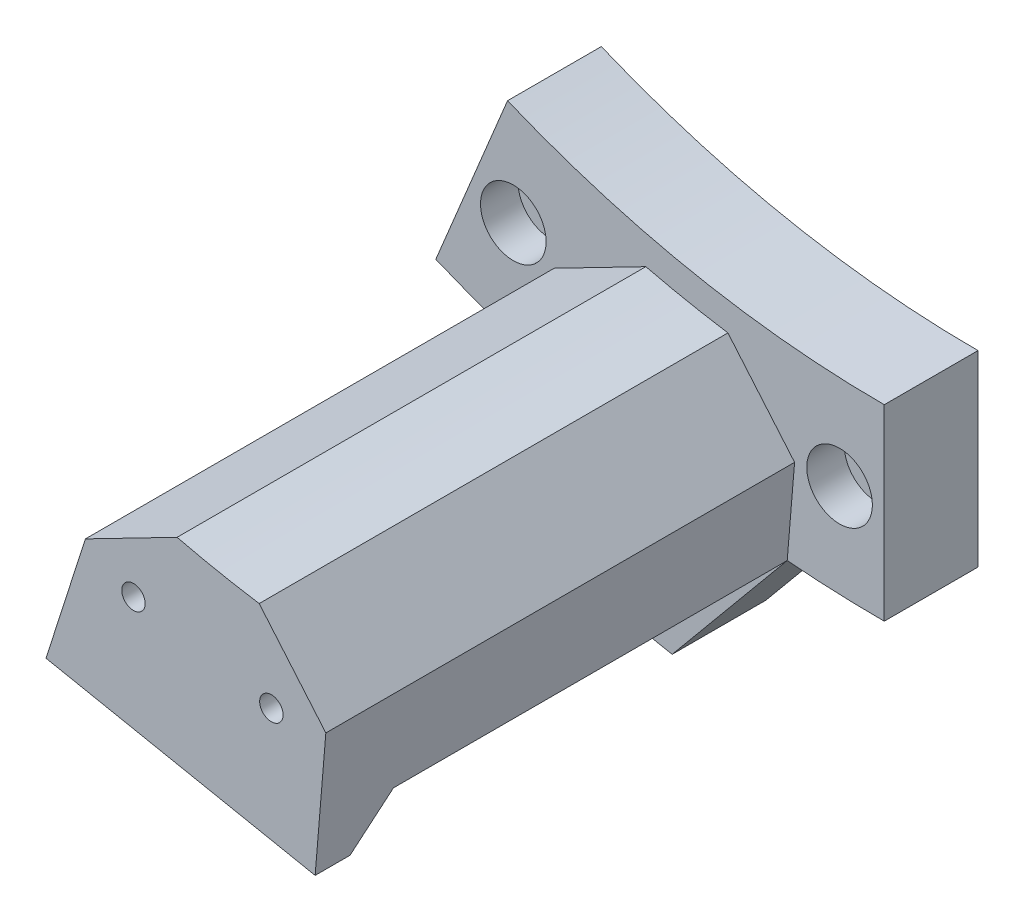
ISO-10303-21;
HEADER;
FILE_DESCRIPTION(('STEP AP214'),'2;1');
FILE_NAME('part.step','',(''),(''),'','','');
FILE_SCHEMA(('AUTOMOTIVE_DESIGN { 1 0 10303 214 1 1 1 1 }'));
ENDSEC;
DATA;
#1=APPLICATION_CONTEXT('core data for automotive mechanical design processes');
#2=APPLICATION_PROTOCOL_DEFINITION('international standard','automotive_design',2000,#1);
#3=PRODUCT_CONTEXT('',#1,'mechanical');
#4=PRODUCT('Part','Part','',(#3));
#5=PRODUCT_RELATED_PRODUCT_CATEGORY('part','',(#4));
#6=PRODUCT_DEFINITION_FORMATION('','',#4);
#7=PRODUCT_DEFINITION_CONTEXT('part definition',#1,'design');
#8=PRODUCT_DEFINITION('design','',#6,#7);
#9=PRODUCT_DEFINITION_SHAPE('','',#8);
#10=(LENGTH_UNIT() NAMED_UNIT(*) SI_UNIT(.MILLI.,.METRE.));
#11=(NAMED_UNIT(*) PLANE_ANGLE_UNIT() SI_UNIT($,.RADIAN.));
#12=(NAMED_UNIT(*) SI_UNIT($,.STERADIAN.) SOLID_ANGLE_UNIT());
#13=UNCERTAINTY_MEASURE_WITH_UNIT(LENGTH_MEASURE(1.E-05),#10,'distance_accuracy_value','');
#14=(GEOMETRIC_REPRESENTATION_CONTEXT(3) GLOBAL_UNCERTAINTY_ASSIGNED_CONTEXT((#13)) GLOBAL_UNIT_ASSIGNED_CONTEXT((#10,
#11,#12)) REPRESENTATION_CONTEXT('',''));
#15=CARTESIAN_POINT('',(0.,0.,0.));
#16=DIRECTION('',(0.,0.,1.));
#17=DIRECTION('',(1.,0.,0.));
#18=AXIS2_PLACEMENT_3D('',#15,#16,#17);
#19=CARTESIAN_POINT('',(0.,0.,10.));
#20=DIRECTION('',(0.,0.,-1.));
#21=DIRECTION('',(-1.,0.,0.));
#22=AXIS2_PLACEMENT_3D('',#19,#20,#21);
#23=CYLINDRICAL_SURFACE('',#22,125.);
#24=DIRECTION('',(0.,0.,-1.));
#25=VECTOR('',#24,1.);
#26=CARTESIAN_POINT('',(-10.3510259390256,-124.57068781222,10.));
#27=LINE('',#26,#25);
#28=CARTESIAN_POINT('',(-10.3510259390255,-124.57068781222,10.));
#29=VERTEX_POINT('',#28);
#30=CARTESIAN_POINT('',(-10.3510259390256,-124.57068781222,0.));
#31=VERTEX_POINT('',#30);
#32=EDGE_CURVE('E173',#29,#31,#27,.T.);
#33=ORIENTED_EDGE('',*,*,#32,.T.);
#34=CARTESIAN_POINT('',(0.,0.,0.));
#35=DIRECTION('',(0.,0.,1.));
#36=DIRECTION('',(-1.,0.,0.));
#37=AXIS2_PLACEMENT_3D('',#34,#35,#36);
#38=CIRCLE('',#37,125.);
#39=CARTESIAN_POINT('',(0.,-125.,0.));
#40=VERTEX_POINT('',#39);
#41=EDGE_CURVE('E253',#31,#40,#38,.T.);
#42=ORIENTED_EDGE('',*,*,#41,.T.);
#43=DIRECTION('',(0.,0.,-1.));
#44=VECTOR('',#43,1.);
#45=CARTESIAN_POINT('',(0.,-125.,10.));
#46=LINE('',#45,#44);
#47=CARTESIAN_POINT('',(0.,-125.,10.));
#48=VERTEX_POINT('',#47);
#49=EDGE_CURVE('E279',#48,#40,#46,.T.);
#50=ORIENTED_EDGE('',*,*,#49,.F.);
#51=CARTESIAN_POINT('',(0.,0.,10.));
#52=DIRECTION('',(0.,0.,1.));
#53=DIRECTION('',(-1.,0.,0.));
#54=AXIS2_PLACEMENT_3D('',#51,#52,#53);
#55=CIRCLE('',#54,125.);
#56=EDGE_CURVE('E258',#29,#48,#55,.T.);
#57=ORIENTED_EDGE('',*,*,#56,.F.);
#58=EDGE_LOOP('',(#33,#42,#50,#57));
#59=FACE_BOUND('',#58,.T.);
#60=ADVANCED_FACE('F40',(#59),#23,.T.);
#61=CARTESIAN_POINT('',(0.,0.,10.));
#62=DIRECTION('',(0.,0.,-1.));
#63=DIRECTION('',(-1.,0.,0.));
#64=AXIS2_PLACEMENT_3D('',#61,#62,#63);
#65=CIRCLE('',#64,125.);
#66=CARTESIAN_POINT('',(-38.1080373785014,-119.04947495541,10.));
#67=VERTEX_POINT('',#66);
#68=EDGE_CURVE('E169',#29,#67,#65,.T.);
#69=ORIENTED_EDGE('',*,*,#68,.F.);
#70=DIRECTION('',(0.,0.,-1.));
#71=VECTOR('',#70,1.);
#72=CARTESIAN_POINT('',(-10.3510259390255,-124.57068781222,58.));
#73=LINE('',#72,#71);
#74=CARTESIAN_POINT('',(-10.3510259390255,-124.57068781222,52.));
#75=VERTEX_POINT('',#74);
#76=EDGE_CURVE('E250',#75,#29,#73,.T.);
#77=ORIENTED_EDGE('',*,*,#76,.F.);
#78=CARTESIAN_POINT('',(0.,0.,52.));
#79=DIRECTION('',(0.,0.,1.));
#80=DIRECTION('',(1.,0.,0.));
#81=AXIS2_PLACEMENT_3D('',#78,#79,#80);
#82=CIRCLE('',#81,125.);
#83=CARTESIAN_POINT('',(-38.1080373785014,-119.04947495541,52.));
#84=VERTEX_POINT('',#83);
#85=EDGE_CURVE('E282',#75,#84,#82,.F.);
#86=ORIENTED_EDGE('',*,*,#85,.T.);
#87=DIRECTION('',(0.,0.,-1.));
#88=VECTOR('',#87,1.);
#89=CARTESIAN_POINT('',(-38.1080373785014,-119.04947495541,58.));
#90=LINE('',#89,#88);
#91=EDGE_CURVE('E247',#84,#67,#90,.T.);
#92=ORIENTED_EDGE('',*,*,#91,.T.);
#93=EDGE_LOOP('',(#69,#77,#86,#92));
#94=FACE_BOUND('',#93,.T.);
#95=ADVANCED_FACE('F329',(#94),#23,.T.);
#96=CARTESIAN_POINT('',(-39.5679831879644,-107.978584480613,-0.000999999999999265));
#97=DIRECTION('',(0.,0.,1.));
#98=DIRECTION('',(1.,0.,0.));
#99=AXIS2_PLACEMENT_3D('',#96,#97,#98);
#100=CYLINDRICAL_SURFACE('',#99,1.75);
#101=CARTESIAN_POINT('',(-39.5679831879644,-107.978584480613,0.));
#102=DIRECTION('',(0.,0.,-1.));
#103=DIRECTION('',(-1.,0.,0.));
#104=AXIS2_PLACEMENT_3D('',#101,#102,#103);
#105=CIRCLE('',#104,1.75);
#106=CARTESIAN_POINT('',(-41.3179831879644,-107.978584480613,0.));
#107=VERTEX_POINT('',#106);
#108=EDGE_CURVE('E221',#107,#107,#105,.F.);
#109=ORIENTED_EDGE('',*,*,#108,.F.);
#110=EDGE_LOOP('',(#109));
#111=FACE_BOUND('',#110,.T.);
#112=CARTESIAN_POINT('',(-39.5679831879644,-107.978584480613,6.));
#113=DIRECTION('',(0.,0.,1.));
#114=DIRECTION('',(1.,0.,0.));
#115=AXIS2_PLACEMENT_3D('',#112,#113,#114);
#116=CIRCLE('',#115,1.75);
#117=CARTESIAN_POINT('',(-37.8179831879644,-107.978584480613,6.));
#118=VERTEX_POINT('',#117);
#119=EDGE_CURVE('E224',#118,#118,#116,.F.);
#120=ORIENTED_EDGE('',*,*,#119,.F.);
#121=EDGE_LOOP('',(#120));
#122=FACE_BOUND('',#121,.T.);
#123=ADVANCED_FACE('F335',(#111,#122),#100,.F.);
#124=CARTESIAN_POINT('',(-4.76556552085401,-114.901215769314,-0.000999999999999265));
#125=DIRECTION('',(0.,0.,1.));
#126=DIRECTION('',(1.,0.,0.));
#127=AXIS2_PLACEMENT_3D('',#124,#125,#126);
#128=CYLINDRICAL_SURFACE('',#127,1.75000000000001);
#129=CARTESIAN_POINT('',(-4.76556552085401,-114.901215769314,0.));
#130=DIRECTION('',(0.,0.,-1.));
#131=DIRECTION('',(-1.,0.,0.));
#132=AXIS2_PLACEMENT_3D('',#129,#130,#131);
#133=CIRCLE('',#132,1.75000000000001);
#134=CARTESIAN_POINT('',(-6.51556552085402,-114.901215769314,0.));
#135=VERTEX_POINT('',#134);
#136=EDGE_CURVE('E217',#135,#135,#133,.F.);
#137=ORIENTED_EDGE('',*,*,#136,.F.);
#138=EDGE_LOOP('',(#137));
#139=FACE_BOUND('',#138,.T.);
#140=CARTESIAN_POINT('',(-4.76556552085401,-114.901215769314,6.));
#141=DIRECTION('',(0.,0.,1.));
#142=DIRECTION('',(1.,0.,0.));
#143=AXIS2_PLACEMENT_3D('',#140,#141,#142);
#144=CIRCLE('',#143,1.75000000000001);
#145=CARTESIAN_POINT('',(-3.01556552085401,-114.901215769314,6.));
#146=VERTEX_POINT('',#145);
#147=EDGE_CURVE('E208',#146,#146,#144,.F.);
#148=ORIENTED_EDGE('',*,*,#147,.F.);
#149=EDGE_LOOP('',(#148));
#150=FACE_BOUND('',#149,.T.);
#151=ADVANCED_FACE('F347',(#139,#150),#128,.F.);
#152=CARTESIAN_POINT('',(0.,0.,10.));
#153=DIRECTION('',(0.,0.,-1.));
#154=DIRECTION('',(-1.,0.,0.));
#155=AXIS2_PLACEMENT_3D('',#152,#153,#154);
#156=PLANE('',#155);
#157=CARTESIAN_POINT('',(-39.5679831879644,-107.978584480613,10.));
#158=DIRECTION('',(0.,0.,1.));
#159=DIRECTION('',(1.,0.,0.));
#160=AXIS2_PLACEMENT_3D('',#157,#158,#159);
#161=CIRCLE('',#160,3.5);
#162=CARTESIAN_POINT('',(-36.0679831879644,-107.978584480613,10.));
#163=VERTEX_POINT('',#162);
#164=EDGE_CURVE('E209',#163,#163,#161,.T.);
#165=ORIENTED_EDGE('',*,*,#164,.F.);
#166=EDGE_LOOP('',(#165));
#167=FACE_BOUND('',#166,.T.);
#168=CARTESIAN_POINT('',(-4.76556552085401,-114.901215769314,10.));
#169=DIRECTION('',(0.,0.,1.));
#170=DIRECTION('',(1.,0.,0.));
#171=AXIS2_PLACEMENT_3D('',#168,#169,#170);
#172=CIRCLE('',#171,3.5);
#173=CARTESIAN_POINT('',(-1.26556552085401,-114.901215769314,10.));
#174=VERTEX_POINT('',#173);
#175=EDGE_CURVE('E196',#174,#174,#172,.T.);
#176=ORIENTED_EDGE('',*,*,#175,.F.);
#177=EDGE_LOOP('',(#176));
#178=FACE_BOUND('',#177,.T.);
#179=DIRECTION('',(-0.304864299028011,-0.952395799643278,0.));
#180=VECTOR('',#179,1.);
#181=CARTESIAN_POINT('',(-32.9253442950252,-102.858746361474,10.));
#182=LINE('',#181,#180);
#183=CARTESIAN_POINT('',(-35.2118265377353,-110.001714858799,10.));
#184=VERTEX_POINT('',#183);
#185=EDGE_CURVE('E244',#184,#67,#182,.T.);
#186=ORIENTED_EDGE('',*,*,#185,.F.);
#187=DIRECTION('',(-0.889017141485737,-0.457873915116956,0.));
#188=VECTOR('',#187,1.);
#189=CARTESIAN_POINT('',(37.3949441605316,-72.6067706982671,10.));
#190=LINE('',#189,#188);
#191=CARTESIAN_POINT('',(-25.4295453835583,-104.963508999964,10.));
#192=VERTEX_POINT('',#191);
#193=EDGE_CURVE('E11',#184,#192,#190,.F.);
#194=ORIENTED_EDGE('',*,*,#193,.T.);
#195=CARTESIAN_POINT('',(0.,0.,10.));
#196=DIRECTION('',(0.,0.,-1.));
#197=DIRECTION('',(-1.,0.,0.));
#198=AXIS2_PLACEMENT_3D('',#195,#196,#197);
#199=CIRCLE('',#198,108.);
#200=CARTESIAN_POINT('',(-16.6739593962537,-106.705103336495,10.));
#201=VERTEX_POINT('',#200);
#202=EDGE_CURVE('E241',#201,#192,#199,.T.);
#203=ORIENTED_EDGE('',*,*,#202,.F.);
#204=DIRECTION('',(-0.646123979642962,0.76323246978253,0.));
#205=VECTOR('',#204,1.);
#206=CARTESIAN_POINT('',(-62.3338317530755,-52.7694837854156,10.));
#207=LINE('',#206,#205);
#208=CARTESIAN_POINT('',(-9.56434796765956,-115.103315538491,10.));
#209=VERTEX_POINT('',#208);
#210=EDGE_CURVE('E49',#201,#209,#207,.F.);
#211=ORIENTED_EDGE('',*,*,#210,.T.);
#212=DIRECTION('',(0.0828082075122041,0.996565502497762,0.));
#213=VECTOR('',#212,1.);
#214=CARTESIAN_POINT('',(-8.94328641131803,-107.629074269758,10.));
#215=LINE('',#214,#213);
#216=EDGE_CURVE('E238',#29,#209,#215,.T.);
#217=ORIENTED_EDGE('',*,*,#216,.F.);
#218=ORIENTED_EDGE('',*,*,#56,.T.);
#219=DIRECTION('',(0.,1.,0.));
#220=VECTOR('',#219,1.);
#221=CARTESIAN_POINT('',(0.,-105.,10.));
#222=LINE('',#221,#220);
#223=CARTESIAN_POINT('',(0.,-105.,10.));
#224=VERTEX_POINT('',#223);
#225=EDGE_CURVE('E257',#48,#224,#222,.T.);
#226=ORIENTED_EDGE('',*,*,#225,.T.);
#227=CARTESIAN_POINT('',(0.,0.,10.));
#228=DIRECTION('',(0.,0.,-1.));
#229=DIRECTION('',(-1.,0.,0.));
#230=AXIS2_PLACEMENT_3D('',#227,#228,#229);
#231=CIRCLE('',#230,105.);
#232=CARTESIAN_POINT('',(-40.1817603983344,-97.0073509136851,10.));
#233=VERTEX_POINT('',#232);
#234=EDGE_CURVE('E260',#224,#233,#231,.T.);
#235=ORIENTED_EDGE('',*,*,#234,.T.);
#236=DIRECTION('',(-0.38268343236509,-0.923879532511286,0.));
#237=VECTOR('',#236,1.);
#238=CARTESIAN_POINT('',(-40.1817603983345,-97.0073509136851,10.));
#239=LINE('',#238,#237);
#240=CARTESIAN_POINT('',(-47.8354290456363,-115.484941563911,10.));
#241=VERTEX_POINT('',#240);
#242=EDGE_CURVE('E262',#233,#241,#239,.T.);
#243=ORIENTED_EDGE('',*,*,#242,.T.);
#244=EDGE_CURVE('E254',#241,#67,#55,.T.);
#245=ORIENTED_EDGE('',*,*,#244,.T.);
#246=EDGE_LOOP('',(#186,#194,#203,#211,#217,#218,#226,#235,#243,#245));
#247=FACE_BOUND('',#246,.T.);
#248=ADVANCED_FACE('F339',(#167,#178,#247),#156,.F.);
#249=CARTESIAN_POINT('',(-47.8354290456363,-115.484941563911,0.));
#250=VERTEX_POINT('',#249);
#251=CARTESIAN_POINT('',(-38.1080373785015,-119.04947495541,0.));
#252=VERTEX_POINT('',#251);
#253=EDGE_CURVE('E56',#250,#252,#38,.T.);
#254=ORIENTED_EDGE('',*,*,#253,.T.);
#255=DIRECTION('',(0.,0.,-1.));
#256=VECTOR('',#255,1.);
#257=CARTESIAN_POINT('',(-38.1080373785014,-119.04947495541,10.));
#258=LINE('',#257,#256);
#259=EDGE_CURVE('E190',#67,#252,#258,.T.);
#260=ORIENTED_EDGE('',*,*,#259,.F.);
#261=ORIENTED_EDGE('',*,*,#244,.F.);
#262=DIRECTION('',(0.,0.,-1.));
#263=VECTOR('',#262,1.);
#264=CARTESIAN_POINT('',(-47.8354290456363,-115.484941563911,10.));
#265=LINE('',#264,#263);
#266=EDGE_CURVE('E264',#241,#250,#265,.T.);
#267=ORIENTED_EDGE('',*,*,#266,.T.);
#268=EDGE_LOOP('',(#254,#260,#261,#267));
#269=FACE_BOUND('',#268,.T.);
#270=ADVANCED_FACE('F311',(#269),#23,.T.);
#271=CARTESIAN_POINT('',(0.,-105.,10.));
#272=DIRECTION('',(-1.,0.,0.));
#273=DIRECTION('',(0.,-1.,0.));
#274=AXIS2_PLACEMENT_3D('',#271,#272,#273);
#275=PLANE('',#274);
#276=DIRECTION('',(0.,1.,0.));
#277=VECTOR('',#276,1.);
#278=CARTESIAN_POINT('',(0.,-105.,0.));
#279=LINE('',#278,#277);
#280=CARTESIAN_POINT('',(0.,-105.,0.));
#281=VERTEX_POINT('',#280);
#282=EDGE_CURVE('E266',#40,#281,#279,.T.);
#283=ORIENTED_EDGE('',*,*,#282,.T.);
#284=DIRECTION('',(0.,0.,-1.));
#285=VECTOR('',#284,1.);
#286=CARTESIAN_POINT('',(0.,-105.,10.));
#287=LINE('',#286,#285);
#288=EDGE_CURVE('E276',#224,#281,#287,.T.);
#289=ORIENTED_EDGE('',*,*,#288,.F.);
#290=ORIENTED_EDGE('',*,*,#225,.F.);
#291=ORIENTED_EDGE('',*,*,#49,.T.);
#292=EDGE_LOOP('',(#283,#289,#290,#291));
#293=FACE_BOUND('',#292,.T.);
#294=ADVANCED_FACE('F338',(#293),#275,.F.);
#295=CARTESIAN_POINT('',(0.,0.,10.));
#296=DIRECTION('',(0.,0.,-1.));
#297=DIRECTION('',(-1.,0.,0.));
#298=AXIS2_PLACEMENT_3D('',#295,#296,#297);
#299=CYLINDRICAL_SURFACE('',#298,105.);
#300=CARTESIAN_POINT('',(0.,0.,0.));
#301=DIRECTION('',(0.,0.,-1.));
#302=DIRECTION('',(-1.,0.,0.));
#303=AXIS2_PLACEMENT_3D('',#300,#301,#302);
#304=CIRCLE('',#303,105.);
#305=CARTESIAN_POINT('',(-40.1817603983344,-97.0073509136851,0.));
#306=VERTEX_POINT('',#305);
#307=EDGE_CURVE('E268',#281,#306,#304,.T.);
#308=ORIENTED_EDGE('',*,*,#307,.T.);
#309=DIRECTION('',(0.,0.,-1.));
#310=VECTOR('',#309,1.);
#311=CARTESIAN_POINT('',(-40.1817603983344,-97.0073509136851,10.));
#312=LINE('',#311,#310);
#313=EDGE_CURVE('E273',#233,#306,#312,.T.);
#314=ORIENTED_EDGE('',*,*,#313,.F.);
#315=ORIENTED_EDGE('',*,*,#234,.F.);
#316=ORIENTED_EDGE('',*,*,#288,.T.);
#317=EDGE_LOOP('',(#308,#314,#315,#316));
#318=FACE_BOUND('',#317,.T.);
#319=ADVANCED_FACE('F345',(#318),#299,.F.);
#320=CARTESIAN_POINT('',(-40.1817603983345,-97.0073509136851,10.));
#321=DIRECTION('',(0.923879532511287,-0.38268343236509,0.));
#322=DIRECTION('',(0.38268343236509,0.923879532511287,0.));
#323=AXIS2_PLACEMENT_3D('',#320,#321,#322);
#324=PLANE('',#323);
#325=DIRECTION('',(-0.38268343236509,-0.923879532511286,0.));
#326=VECTOR('',#325,1.);
#327=CARTESIAN_POINT('',(-40.1817603983345,-97.0073509136851,0.));
#328=LINE('',#327,#326);
#329=EDGE_CURVE('E270',#306,#250,#328,.T.);
#330=ORIENTED_EDGE('',*,*,#329,.T.);
#331=ORIENTED_EDGE('',*,*,#266,.F.);
#332=ORIENTED_EDGE('',*,*,#242,.F.);
#333=ORIENTED_EDGE('',*,*,#313,.T.);
#334=EDGE_LOOP('',(#330,#331,#332,#333));
#335=FACE_BOUND('',#334,.T.);
#336=ADVANCED_FACE('F364',(#335),#324,.F.);
#337=CARTESIAN_POINT('',(0.,0.,0.));
#338=DIRECTION('',(0.,0.,-1.));
#339=DIRECTION('',(-1.,0.,0.));
#340=AXIS2_PLACEMENT_3D('',#337,#338,#339);
#341=PLANE('',#340);
#342=ORIENTED_EDGE('',*,*,#136,.T.);
#343=EDGE_LOOP('',(#342));
#344=FACE_BOUND('',#343,.T.);
#345=ORIENTED_EDGE('',*,*,#108,.T.);
#346=EDGE_LOOP('',(#345));
#347=FACE_BOUND('',#346,.T.);
#348=ORIENTED_EDGE('',*,*,#253,.F.);
#349=ORIENTED_EDGE('',*,*,#329,.F.);
#350=ORIENTED_EDGE('',*,*,#307,.F.);
#351=ORIENTED_EDGE('',*,*,#282,.F.);
#352=ORIENTED_EDGE('',*,*,#41,.F.);
#353=DIRECTION('',(0.638255147729026,0.769824893334451,0.));
#354=VECTOR('',#353,1.);
#355=CARTESIAN_POINT('',(55.0728150641998,-45.6603937064205,0.));
#356=LINE('',#355,#354);
#357=CARTESIAN_POINT('',(-22.625550905417,-139.375480075322,0.));
#358=VERTEX_POINT('',#357);
#359=EDGE_CURVE('E184',#358,#31,#356,.T.);
#360=ORIENTED_EDGE('',*,*,#359,.F.);
#361=DIRECTION('',(0.98078528040323,-0.195090322016128,0.));
#362=VECTOR('',#361,1.);
#363=CARTESIAN_POINT('',(-27.5294773074331,-138.400028465241,0.));
#364=LINE('',#363,#362);
#365=CARTESIAN_POINT('',(-32.4334037094493,-137.42457685516,0.));
#366=VERTEX_POINT('',#365);
#367=EDGE_CURVE('E164',#366,#358,#364,.T.);
#368=ORIENTED_EDGE('',*,*,#367,.F.);
#369=DIRECTION('',(-0.295071635005498,0.955475133227015,0.));
#370=VECTOR('',#369,1.);
#371=CARTESIAN_POINT('',(-68.3541228223079,-21.1092492929933,0.));
#372=LINE('',#371,#370);
#373=EDGE_CURVE('E174',#366,#252,#372,.T.);
#374=ORIENTED_EDGE('',*,*,#373,.T.);
#375=EDGE_LOOP('',(#348,#349,#350,#351,#352,#360,#368,#374));
#376=FACE_BOUND('',#375,.T.);
#377=ADVANCED_FACE('F361',(#344,#347,#376),#341,.T.);
#378=CARTESIAN_POINT('',(-8.94328641131803,-107.629074269758,58.));
#379=DIRECTION('',(-0.996565502497761,0.0828082075122041,0.));
#380=DIRECTION('',(-0.0828082075122041,-0.996565502497761,0.));
#381=AXIS2_PLACEMENT_3D('',#378,#379,#380);
#382=PLANE('',#381);
#383=ORIENTED_EDGE('',*,*,#216,.T.);
#384=DIRECTION('',(0.,0.,1.));
#385=VECTOR('',#384,1.);
#386=CARTESIAN_POINT('',(-9.56434796765956,-115.103315538491,58.));
#387=LINE('',#386,#385);
#388=CARTESIAN_POINT('',(-9.56434796765954,-115.103315538491,60.));
#389=VERTEX_POINT('',#388);
#390=EDGE_CURVE('E404',#209,#389,#387,.T.);
#391=ORIENTED_EDGE('',*,*,#390,.T.);
#392=DIRECTION('',(0.0828082075122008,0.996565502497762,0.));
#393=VECTOR('',#392,1.);
#394=CARTESIAN_POINT('',(-10.705530952967,-128.837021765948,60.));
#395=LINE('',#394,#393);
#396=CARTESIAN_POINT('',(-10.705530952967,-128.837021765948,60.));
#397=VERTEX_POINT('',#396);
#398=EDGE_CURVE('E231',#397,#389,#395,.T.);
#399=ORIENTED_EDGE('',*,*,#398,.F.);
#400=DIRECTION('',(0.,0.,-1.));
#401=VECTOR('',#400,1.);
#402=CARTESIAN_POINT('',(-10.705530952967,-128.837021765948,60.));
#403=LINE('',#402,#401);
#404=CARTESIAN_POINT('',(-10.705530952967,-128.837021765948,56.2810371651781));
#405=VERTEX_POINT('',#404);
#406=EDGE_CURVE('E234',#397,#405,#403,.T.);
#407=ORIENTED_EDGE('',*,*,#406,.T.);
#408=DIRECTION('',(-0.0585542450697827,-0.704678224712751,0.707106781186543));
#409=VECTOR('',#408,1.);
#410=CARTESIAN_POINT('',(0.,0.,-72.9999999999985));
#411=LINE('',#410,#409);
#412=EDGE_CURVE('E294',#405,#75,#411,.F.);
#413=ORIENTED_EDGE('',*,*,#412,.T.);
#414=ORIENTED_EDGE('',*,*,#76,.T.);
#415=EDGE_LOOP('',(#383,#391,#399,#407,#413,#414));
#416=FACE_BOUND('',#415,.T.);
#417=ADVANCED_FACE('F359',(#416),#382,.F.);
#418=CARTESIAN_POINT('',(0.,0.,58.));
#419=DIRECTION('',(0.,0.,-1.));
#420=DIRECTION('',(-1.,0.,0.));
#421=AXIS2_PLACEMENT_3D('',#418,#419,#420);
#422=CYLINDRICAL_SURFACE('',#421,108.);
#423=CARTESIAN_POINT('',(0.,0.,60.));
#424=DIRECTION('',(0.,0.,-1.));
#425=DIRECTION('',(1.,0.,0.));
#426=AXIS2_PLACEMENT_3D('',#423,#424,#425);
#427=CIRCLE('',#426,108.);
#428=CARTESIAN_POINT('',(-16.6739593962537,-106.705103336495,60.));
#429=VERTEX_POINT('',#428);
#430=CARTESIAN_POINT('',(-25.4295453835583,-104.963508999964,60.));
#431=VERTEX_POINT('',#430);
#432=EDGE_CURVE('E220',#429,#431,#427,.T.);
#433=ORIENTED_EDGE('',*,*,#432,.F.);
#434=DIRECTION('',(0.,0.,-1.));
#435=VECTOR('',#434,1.);
#436=CARTESIAN_POINT('',(-16.6739593962537,-106.705103336495,58.));
#437=LINE('',#436,#435);
#438=EDGE_CURVE('E409',#429,#201,#437,.T.);
#439=ORIENTED_EDGE('',*,*,#438,.T.);
#440=ORIENTED_EDGE('',*,*,#202,.T.);
#441=DIRECTION('',(0.,0.,-1.));
#442=VECTOR('',#441,1.);
#443=CARTESIAN_POINT('',(-25.4295453835583,-104.963508999964,58.));
#444=LINE('',#443,#442);
#445=EDGE_CURVE('E412',#192,#431,#444,.F.);
#446=ORIENTED_EDGE('',*,*,#445,.T.);
#447=EDGE_LOOP('',(#433,#439,#440,#446));
#448=FACE_BOUND('',#447,.T.);
#449=ADVANCED_FACE('F421',(#448),#422,.F.);
#450=CARTESIAN_POINT('',(-32.9253442950252,-102.858746361474,58.));
#451=DIRECTION('',(0.952395799643278,-0.304864299028011,0.));
#452=DIRECTION('',(0.304864299028011,0.952395799643278,0.));
#453=AXIS2_PLACEMENT_3D('',#450,#451,#452);
#454=PLANE('',#453);
#455=DIRECTION('',(-0.304864299028014,-0.952395799643277,0.));
#456=VECTOR('',#455,1.);
#457=CARTESIAN_POINT('',(-32.9253442950252,-102.858746361474,60.));
#458=LINE('',#457,#456);
#459=CARTESIAN_POINT('',(-35.2118265377353,-110.001714858799,60.));
#460=VERTEX_POINT('',#459);
#461=CARTESIAN_POINT('',(-39.4131727729763,-123.126716769642,60.));
#462=VERTEX_POINT('',#461);
#463=EDGE_CURVE('E227',#460,#462,#458,.T.);
#464=ORIENTED_EDGE('',*,*,#463,.F.);
#465=DIRECTION('',(0.,0.,-1.));
#466=VECTOR('',#465,1.);
#467=CARTESIAN_POINT('',(-35.2118265377353,-110.001714858799,58.));
#468=LINE('',#467,#466);
#469=EDGE_CURVE('E392',#460,#184,#468,.T.);
#470=ORIENTED_EDGE('',*,*,#469,.T.);
#471=ORIENTED_EDGE('',*,*,#185,.T.);
#472=ORIENTED_EDGE('',*,*,#91,.F.);
#473=DIRECTION('',(0.215571613184391,0.673445528301351,-0.707106781186543));
#474=VECTOR('',#473,1.);
#475=CARTESIAN_POINT('',(0.,0.,-72.9999999999985));
#476=LINE('',#475,#474);
#477=CARTESIAN_POINT('',(-39.4131727729763,-123.126716769642,56.2810371651781));
#478=VERTEX_POINT('',#477);
#479=EDGE_CURVE('E422',#84,#478,#476,.F.);
#480=ORIENTED_EDGE('',*,*,#479,.T.);
#481=DIRECTION('',(0.,0.,-1.));
#482=VECTOR('',#481,1.);
#483=CARTESIAN_POINT('',(-39.4131727729763,-123.126716769642,60.));
#484=LINE('',#483,#482);
#485=EDGE_CURVE('E236',#462,#478,#484,.T.);
#486=ORIENTED_EDGE('',*,*,#485,.F.);
#487=EDGE_LOOP('',(#464,#470,#471,#472,#480,#486));
#488=FACE_BOUND('',#487,.T.);
#489=ADVANCED_FACE('F390',(#488),#454,.F.);
#490=CARTESIAN_POINT('',(-39.4131727729763,-123.126716769642,60.));
#491=DIRECTION('',(0.195090322016128,0.980785280403231,0.));
#492=DIRECTION('',(-0.980785280403231,0.195090322016128,0.));
#493=AXIS2_PLACEMENT_3D('',#490,#491,#492);
#494=PLANE('',#493);
#495=ORIENTED_EDGE('',*,*,#485,.T.);
#496=CARTESIAN_POINT('',(-39.4131727729763,-123.126716769642,56.2810371651781));
#497=CARTESIAN_POINT('',(-38.2201790916378,-123.364017967066,56.1433083503061));
#498=CARTESIAN_POINT('',(-37.025306607688,-123.601692881566,56.0223725359379));
#499=CARTESIAN_POINT('',(-34.6326903117571,-124.07761385322,55.8146060129514));
#500=CARTESIAN_POINT('',(-33.4349464418977,-124.315859921889,55.7277759977163));
#501=CARTESIAN_POINT('',(-31.0413679692097,-124.7919722824,55.5889688400575));
#502=CARTESIAN_POINT('',(-29.8455395690514,-125.029837340455,55.5368807754856));
#503=CARTESIAN_POINT('',(-27.4529247269721,-125.505758022921,55.4673965328125));
#504=CARTESIAN_POINT('',(-26.2561382949719,-125.743813645358,55.4499999999999));
#505=CARTESIAN_POINT('',(-23.8625654309714,-126.219924890232,55.4499999999999));
#506=CARTESIAN_POINT('',(-22.6657789989712,-126.457980512669,55.4673965328125));
#507=CARTESIAN_POINT('',(-20.2731641568919,-126.933901195135,55.5368807754856));
#508=CARTESIAN_POINT('',(-19.0773357567337,-127.17176625319,55.5889688400575));
#509=CARTESIAN_POINT('',(-16.6837572840457,-127.647878613701,55.7277759977163));
#510=CARTESIAN_POINT('',(-15.4860134141863,-127.88612468237,55.8146060129515));
#511=CARTESIAN_POINT('',(-13.0933971182553,-128.362045654024,56.0223725359379));
#512=CARTESIAN_POINT('',(-11.8985246343055,-128.599720568524,56.1433083503061));
#513=CARTESIAN_POINT('',(-10.705530952967,-128.837021765948,56.2810371651781));
#514=B_SPLINE_CURVE_WITH_KNOTS('',3,(#496,#497,#498,#499,#500,#501,#502,#503,#504,#505,#506,
#507,#508,#509,#510,#511,#512,#513),.UNSPECIFIED.,.F.,.F.,(4,2,2,2,2,2,2,2,4),(0.,
3.67231993327199,7.3447145222481,11.0053272424226,14.6659025336614,18.3264778249003,
21.9870905450748,25.6594851340509,29.3318050673228),.UNSPECIFIED.);
#515=EDGE_CURVE('E285',#478,#405,#514,.T.);
#516=ORIENTED_EDGE('',*,*,#515,.T.);
#517=ORIENTED_EDGE('',*,*,#406,.F.);
#518=DIRECTION('',(0.98078528040323,-0.195090322016128,0.));
#519=VECTOR('',#518,1.);
#520=CARTESIAN_POINT('',(-39.4131727729763,-123.126716769642,60.));
#521=LINE('',#520,#519);
#522=EDGE_CURVE('E229',#462,#397,#521,.T.);
#523=ORIENTED_EDGE('',*,*,#522,.F.);
#524=EDGE_LOOP('',(#495,#516,#517,#523));
#525=FACE_BOUND('',#524,.T.);
#526=ADVANCED_FACE('F296',(#525),#494,.F.);
#527=CARTESIAN_POINT('',(0.,0.,60.));
#528=DIRECTION('',(0.,0.,1.));
#529=DIRECTION('',(1.,0.,0.));
#530=AXIS2_PLACEMENT_3D('',#527,#528,#529);
#531=PLANE('',#530);
#532=CARTESIAN_POINT('',(-30.0839121179032,-112.798307751855,60.));
#533=DIRECTION('',(0.,0.,1.));
#534=DIRECTION('',(1.,0.,0.));
#535=AXIS2_PLACEMENT_3D('',#532,#533,#534);
#536=CIRCLE('',#535,1.25);
#537=CARTESIAN_POINT('',(-28.8339121179032,-112.798307751855,60.));
#538=VERTEX_POINT('',#537);
#539=EDGE_CURVE('E197',#538,#538,#536,.T.);
#540=ORIENTED_EDGE('',*,*,#539,.F.);
#541=EDGE_LOOP('',(#540));
#542=FACE_BOUND('',#541,.T.);
#543=CARTESIAN_POINT('',(-15.3721329118547,-115.724662582097,60.));
#544=DIRECTION('',(0.,0.,1.));
#545=DIRECTION('',(1.,0.,0.));
#546=AXIS2_PLACEMENT_3D('',#543,#544,#545);
#547=CIRCLE('',#546,1.25);
#548=CARTESIAN_POINT('',(-14.1221329118547,-115.724662582097,60.));
#549=VERTEX_POINT('',#548);
#550=EDGE_CURVE('E189',#549,#549,#547,.T.);
#551=ORIENTED_EDGE('',*,*,#550,.F.);
#552=EDGE_LOOP('',(#551));
#553=FACE_BOUND('',#552,.T.);
#554=ORIENTED_EDGE('',*,*,#398,.T.);
#555=DIRECTION('',(0.646123979642962,-0.76323246978253,0.));
#556=VECTOR('',#555,1.);
#557=CARTESIAN_POINT('',(-62.3338317530755,-52.7694837854156,60.));
#558=LINE('',#557,#556);
#559=EDGE_CURVE('E407',#389,#429,#558,.F.);
#560=ORIENTED_EDGE('',*,*,#559,.T.);
#561=ORIENTED_EDGE('',*,*,#432,.T.);
#562=DIRECTION('',(0.889017141485737,0.457873915116956,0.));
#563=VECTOR('',#562,1.);
#564=CARTESIAN_POINT('',(37.3949441605316,-72.6067706982671,60.));
#565=LINE('',#564,#563);
#566=EDGE_CURVE('E408',#431,#460,#565,.F.);
#567=ORIENTED_EDGE('',*,*,#566,.T.);
#568=ORIENTED_EDGE('',*,*,#463,.T.);
#569=ORIENTED_EDGE('',*,*,#522,.T.);
#570=EDGE_LOOP('',(#554,#560,#561,#567,#568,#569));
#571=FACE_BOUND('',#570,.T.);
#572=ADVANCED_FACE('F309',(#542,#553,#571),#531,.T.);
#573=CARTESIAN_POINT('',(0.,0.,58.));
#574=DIRECTION('',(0.,0.,1.));
#575=DIRECTION('',(1.,0.,0.));
#576=AXIS2_PLACEMENT_3D('',#573,#574,#575);
#577=CONICAL_SURFACE('',#576,131.,0.785398163397455);
#578=ORIENTED_EDGE('',*,*,#479,.F.);
#579=ORIENTED_EDGE('',*,*,#85,.F.);
#580=ORIENTED_EDGE('',*,*,#412,.F.);
#581=ORIENTED_EDGE('',*,*,#515,.F.);
#582=EDGE_LOOP('',(#578,#579,#580,#581));
#583=FACE_BOUND('',#582,.T.);
#584=ADVANCED_FACE('F301',(#583),#577,.T.);
#585=CARTESIAN_POINT('',(-4.76556552085401,-114.901215769314,6.));
#586=DIRECTION('',(0.,0.,1.));
#587=DIRECTION('',(1.,0.,0.));
#588=AXIS2_PLACEMENT_3D('',#585,#586,#587);
#589=PLANE('',#588);
#590=CARTESIAN_POINT('',(-4.76556552085401,-114.901215769314,6.));
#591=DIRECTION('',(0.,0.,1.));
#592=DIRECTION('',(1.,0.,0.));
#593=AXIS2_PLACEMENT_3D('',#590,#591,#592);
#594=CIRCLE('',#593,3.5);
#595=CARTESIAN_POINT('',(-1.26556552085401,-114.901215769314,6.));
#596=VERTEX_POINT('',#595);
#597=EDGE_CURVE('E212',#596,#596,#594,.T.);
#598=ORIENTED_EDGE('',*,*,#597,.T.);
#599=EDGE_LOOP('',(#598));
#600=FACE_BOUND('',#599,.T.);
#601=ORIENTED_EDGE('',*,*,#147,.T.);
#602=EDGE_LOOP('',(#601));
#603=FACE_BOUND('',#602,.T.);
#604=ADVANCED_FACE('F308',(#600,#603),#589,.T.);
#605=CARTESIAN_POINT('',(-4.76556552085401,-114.901215769314,6.));
#606=DIRECTION('',(0.,0.,1.));
#607=DIRECTION('',(1.,0.,0.));
#608=AXIS2_PLACEMENT_3D('',#605,#606,#607);
#609=CYLINDRICAL_SURFACE('',#608,3.5);
#610=ORIENTED_EDGE('',*,*,#597,.F.);
#611=EDGE_LOOP('',(#610));
#612=FACE_BOUND('',#611,.T.);
#613=ORIENTED_EDGE('',*,*,#175,.T.);
#614=EDGE_LOOP('',(#613));
#615=FACE_BOUND('',#614,.T.);
#616=ADVANCED_FACE('F431',(#612,#615),#609,.F.);
#617=CARTESIAN_POINT('',(-39.5679831879644,-107.978584480613,6.));
#618=DIRECTION('',(0.,0.,1.));
#619=DIRECTION('',(1.,0.,0.));
#620=AXIS2_PLACEMENT_3D('',#617,#618,#619);
#621=PLANE('',#620);
#622=CARTESIAN_POINT('',(-39.5679831879644,-107.978584480613,6.));
#623=DIRECTION('',(0.,0.,1.));
#624=DIRECTION('',(1.,0.,0.));
#625=AXIS2_PLACEMENT_3D('',#622,#623,#624);
#626=CIRCLE('',#625,3.5);
#627=CARTESIAN_POINT('',(-36.0679831879644,-107.978584480613,6.));
#628=VERTEX_POINT('',#627);
#629=EDGE_CURVE('E205',#628,#628,#626,.T.);
#630=ORIENTED_EDGE('',*,*,#629,.T.);
#631=EDGE_LOOP('',(#630));
#632=FACE_BOUND('',#631,.T.);
#633=ORIENTED_EDGE('',*,*,#119,.T.);
#634=EDGE_LOOP('',(#633));
#635=FACE_BOUND('',#634,.T.);
#636=ADVANCED_FACE('F324',(#632,#635),#621,.T.);
#637=CARTESIAN_POINT('',(-39.5679831879644,-107.978584480613,6.));
#638=DIRECTION('',(0.,0.,1.));
#639=DIRECTION('',(1.,0.,0.));
#640=AXIS2_PLACEMENT_3D('',#637,#638,#639);
#641=CYLINDRICAL_SURFACE('',#640,3.5);
#642=ORIENTED_EDGE('',*,*,#629,.F.);
#643=EDGE_LOOP('',(#642));
#644=FACE_BOUND('',#643,.T.);
#645=ORIENTED_EDGE('',*,*,#164,.T.);
#646=EDGE_LOOP('',(#645));
#647=FACE_BOUND('',#646,.T.);
#648=ADVANCED_FACE('F317',(#644,#647),#641,.F.);
#649=CARTESIAN_POINT('',(-16.6739593962537,-106.705103336495,58.));
#650=DIRECTION('',(-0.76323246978253,-0.646123979642962,0.));
#651=DIRECTION('',(0.,0.,-1.));
#652=AXIS2_PLACEMENT_3D('',#649,#650,#651);
#653=PLANE('',#652);
#654=ORIENTED_EDGE('',*,*,#559,.F.);
#655=ORIENTED_EDGE('',*,*,#390,.F.);
#656=ORIENTED_EDGE('',*,*,#210,.F.);
#657=ORIENTED_EDGE('',*,*,#438,.F.);
#658=EDGE_LOOP('',(#654,#655,#656,#657));
#659=FACE_BOUND('',#658,.T.);
#660=ADVANCED_FACE('F313',(#659),#653,.F.);
#661=CARTESIAN_POINT('',(-35.2118265377353,-110.001714858799,58.));
#662=DIRECTION('',(0.457873915116956,-0.889017141485737,0.));
#663=DIRECTION('',(0.,0.,-1.));
#664=AXIS2_PLACEMENT_3D('',#661,#662,#663);
#665=PLANE('',#664);
#666=ORIENTED_EDGE('',*,*,#566,.F.);
#667=ORIENTED_EDGE('',*,*,#445,.F.);
#668=ORIENTED_EDGE('',*,*,#193,.F.);
#669=ORIENTED_EDGE('',*,*,#469,.F.);
#670=EDGE_LOOP('',(#666,#667,#668,#669));
#671=FACE_BOUND('',#670,.T.);
#672=ADVANCED_FACE('F43',(#671),#665,.F.);
#673=CARTESIAN_POINT('',(-15.3721329118547,-115.724662582097,50.));
#674=DIRECTION('',(0.,0.,1.));
#675=DIRECTION('',(1.,0.,0.));
#676=AXIS2_PLACEMENT_3D('',#673,#674,#675);
#677=CYLINDRICAL_SURFACE('',#676,1.25);
#678=CARTESIAN_POINT('',(-15.3721329118547,-115.724662582097,50.));
#679=DIRECTION('',(0.,0.,1.));
#680=DIRECTION('',(1.,0.,0.));
#681=AXIS2_PLACEMENT_3D('',#678,#679,#680);
#682=CIRCLE('',#681,1.25);
#683=CARTESIAN_POINT('',(-14.1221329118547,-115.724662582097,50.));
#684=VERTEX_POINT('',#683);
#685=EDGE_CURVE('E200',#684,#684,#682,.T.);
#686=ORIENTED_EDGE('',*,*,#685,.F.);
#687=EDGE_LOOP('',(#686));
#688=FACE_BOUND('',#687,.T.);
#689=ORIENTED_EDGE('',*,*,#550,.T.);
#690=EDGE_LOOP('',(#689));
#691=FACE_BOUND('',#690,.T.);
#692=ADVANCED_FACE('F323',(#688,#691),#677,.F.);
#693=CARTESIAN_POINT('',(-15.3721329118547,-115.724662582097,50.));
#694=DIRECTION('',(0.,0.,1.));
#695=DIRECTION('',(1.,0.,0.));
#696=AXIS2_PLACEMENT_3D('',#693,#694,#695);
#697=PLANE('',#696);
#698=ORIENTED_EDGE('',*,*,#685,.T.);
#699=EDGE_LOOP('',(#698));
#700=FACE_BOUND('',#699,.T.);
#701=ADVANCED_FACE('F454',(#700),#697,.T.);
#702=CARTESIAN_POINT('',(-30.0839121179032,-112.798307751855,50.));
#703=DIRECTION('',(0.,0.,1.));
#704=DIRECTION('',(1.,0.,0.));
#705=AXIS2_PLACEMENT_3D('',#702,#703,#704);
#706=CYLINDRICAL_SURFACE('',#705,1.25);
#707=CARTESIAN_POINT('',(-30.0839121179032,-112.798307751855,50.));
#708=DIRECTION('',(0.,0.,1.));
#709=DIRECTION('',(1.,0.,0.));
#710=AXIS2_PLACEMENT_3D('',#707,#708,#709);
#711=CIRCLE('',#710,1.25);
#712=CARTESIAN_POINT('',(-28.8339121179032,-112.798307751855,50.));
#713=VERTEX_POINT('',#712);
#714=EDGE_CURVE('E193',#713,#713,#711,.T.);
#715=ORIENTED_EDGE('',*,*,#714,.F.);
#716=EDGE_LOOP('',(#715));
#717=FACE_BOUND('',#716,.T.);
#718=ORIENTED_EDGE('',*,*,#539,.T.);
#719=EDGE_LOOP('',(#718));
#720=FACE_BOUND('',#719,.T.);
#721=ADVANCED_FACE('F460',(#717,#720),#706,.F.);
#722=CARTESIAN_POINT('',(-30.0839121179032,-112.798307751855,50.));
#723=DIRECTION('',(0.,0.,1.));
#724=DIRECTION('',(1.,0.,0.));
#725=AXIS2_PLACEMENT_3D('',#722,#723,#724);
#726=PLANE('',#725);
#727=ORIENTED_EDGE('',*,*,#714,.T.);
#728=EDGE_LOOP('',(#727));
#729=FACE_BOUND('',#728,.T.);
#730=ADVANCED_FACE('F526',(#729),#726,.T.);
#731=CARTESIAN_POINT('',(55.0728150641998,-45.6603937064205,10.));
#732=DIRECTION('',(-0.769824893334451,0.638255147729026,0.));
#733=DIRECTION('',(-0.638255147729026,-0.769824893334451,0.));
#734=AXIS2_PLACEMENT_3D('',#731,#732,#733);
#735=PLANE('',#734);
#736=ORIENTED_EDGE('',*,*,#359,.T.);
#737=ORIENTED_EDGE('',*,*,#32,.F.);
#738=DIRECTION('',(0.638255147729026,0.769824893334451,0.));
#739=VECTOR('',#738,1.);
#740=CARTESIAN_POINT('',(55.0728150641998,-45.6603937064205,10.));
#741=LINE('',#740,#739);
#742=CARTESIAN_POINT('',(-22.625550905417,-139.375480075322,10.));
#743=VERTEX_POINT('',#742);
#744=EDGE_CURVE('E154',#743,#29,#741,.T.);
#745=ORIENTED_EDGE('',*,*,#744,.F.);
#746=DIRECTION('',(0.,0.,-1.));
#747=VECTOR('',#746,1.);
#748=CARTESIAN_POINT('',(-22.625550905417,-139.375480075322,10.));
#749=LINE('',#748,#747);
#750=EDGE_CURVE('E161',#743,#358,#749,.T.);
#751=ORIENTED_EDGE('',*,*,#750,.T.);
#752=EDGE_LOOP('',(#736,#737,#745,#751));
#753=FACE_BOUND('',#752,.T.);
#754=ADVANCED_FACE('F171',(#753),#735,.F.);
#755=CARTESIAN_POINT('',(-68.3541228223079,-21.1092492929933,10.));
#756=DIRECTION('',(-0.955475133227015,-0.295071635005498,0.));
#757=DIRECTION('',(0.295071635005498,-0.955475133227015,0.));
#758=AXIS2_PLACEMENT_3D('',#755,#756,#757);
#759=PLANE('',#758);
#760=ORIENTED_EDGE('',*,*,#373,.F.);
#761=DIRECTION('',(0.,0.,-1.));
#762=VECTOR('',#761,1.);
#763=CARTESIAN_POINT('',(-32.4334037094493,-137.42457685516,10.));
#764=LINE('',#763,#762);
#765=CARTESIAN_POINT('',(-32.4334037094493,-137.42457685516,10.));
#766=VERTEX_POINT('',#765);
#767=EDGE_CURVE('E168',#766,#366,#764,.T.);
#768=ORIENTED_EDGE('',*,*,#767,.F.);
#769=DIRECTION('',(-0.295071635005498,0.955475133227015,0.));
#770=VECTOR('',#769,1.);
#771=CARTESIAN_POINT('',(-68.3541228223079,-21.1092492929933,10.));
#772=LINE('',#771,#770);
#773=EDGE_CURVE('E157',#766,#67,#772,.T.);
#774=ORIENTED_EDGE('',*,*,#773,.T.);
#775=ORIENTED_EDGE('',*,*,#259,.T.);
#776=EDGE_LOOP('',(#760,#768,#774,#775));
#777=FACE_BOUND('',#776,.T.);
#778=ADVANCED_FACE('F384',(#777),#759,.T.);
#779=CARTESIAN_POINT('',(-27.5294773074331,-138.400028465241,10.));
#780=DIRECTION('',(0.195090322016128,0.98078528040323,0.));
#781=DIRECTION('',(-0.98078528040323,0.195090322016128,0.));
#782=AXIS2_PLACEMENT_3D('',#779,#780,#781);
#783=PLANE('',#782);
#784=CARTESIAN_POINT('',(-27.5294773074332,-138.400028465241,5.));
#785=DIRECTION('',(-0.195090322016128,-0.98078528040323,0.));
#786=DIRECTION('',(0.98078528040323,-0.195090322016128,0.));
#787=AXIS2_PLACEMENT_3D('',#784,#785,#786);
#788=CIRCLE('',#787,2.75);
#789=CARTESIAN_POINT('',(-24.8323177863243,-138.936526850785,5.));
#790=VERTEX_POINT('',#789);
#791=EDGE_CURVE('E179',#790,#790,#788,.T.);
#792=ORIENTED_EDGE('',*,*,#791,.F.);
#793=EDGE_LOOP('',(#792));
#794=FACE_BOUND('',#793,.T.);
#795=ORIENTED_EDGE('',*,*,#367,.T.);
#796=ORIENTED_EDGE('',*,*,#750,.F.);
#797=DIRECTION('',(0.98078528040323,-0.195090322016128,0.));
#798=VECTOR('',#797,1.);
#799=CARTESIAN_POINT('',(-27.5294773074331,-138.400028465241,10.));
#800=LINE('',#799,#798);
#801=EDGE_CURVE('E149',#766,#743,#800,.T.);
#802=ORIENTED_EDGE('',*,*,#801,.F.);
#803=ORIENTED_EDGE('',*,*,#767,.T.);
#804=EDGE_LOOP('',(#795,#796,#802,#803));
#805=FACE_BOUND('',#804,.T.);
#806=ADVANCED_FACE('F162',(#794,#805),#783,.F.);
#807=CARTESIAN_POINT('',(0.,0.,10.));
#808=DIRECTION('',(0.,0.,-1.));
#809=DIRECTION('',(-1.,0.,0.));
#810=AXIS2_PLACEMENT_3D('',#807,#808,#809);
#811=PLANE('',#810);
#812=ORIENTED_EDGE('',*,*,#744,.T.);
#813=ORIENTED_EDGE('',*,*,#68,.T.);
#814=ORIENTED_EDGE('',*,*,#773,.F.);
#815=ORIENTED_EDGE('',*,*,#801,.T.);
#816=EDGE_LOOP('',(#812,#813,#814,#815));
#817=FACE_BOUND('',#816,.T.);
#818=ADVANCED_FACE('F151',(#817),#811,.F.);
#819=CARTESIAN_POINT('',(-27.1392966634009,-136.438457904434,5.));
#820=DIRECTION('',(-0.195090322016128,-0.98078528040323,0.));
#821=DIRECTION('',(0.98078528040323,-0.195090322016128,0.));
#822=AXIS2_PLACEMENT_3D('',#819,#820,#821);
#823=CYLINDRICAL_SURFACE('',#822,2.75);
#824=CARTESIAN_POINT('',(-27.1392966634009,-136.438457904434,5.));
#825=DIRECTION('',(-0.195090322016128,-0.98078528040323,0.));
#826=DIRECTION('',(0.98078528040323,-0.195090322016128,0.));
#827=AXIS2_PLACEMENT_3D('',#824,#825,#826);
#828=CIRCLE('',#827,2.75);
#829=CARTESIAN_POINT('',(-24.442137142292,-136.974956289979,5.));
#830=VERTEX_POINT('',#829);
#831=EDGE_CURVE('E186',#830,#830,#828,.T.);
#832=ORIENTED_EDGE('',*,*,#831,.F.);
#833=EDGE_LOOP('',(#832));
#834=FACE_BOUND('',#833,.T.);
#835=ORIENTED_EDGE('',*,*,#791,.T.);
#836=EDGE_LOOP('',(#835));
#837=FACE_BOUND('',#836,.T.);
#838=ADVANCED_FACE('F579',(#834,#837),#823,.F.);
#839=CARTESIAN_POINT('',(-27.1392966634009,-136.438457904434,5.));
#840=DIRECTION('',(-0.195090322016128,-0.98078528040323,0.));
#841=DIRECTION('',(0.98078528040323,-0.195090322016128,0.));
#842=AXIS2_PLACEMENT_3D('',#839,#840,#841);
#843=PLANE('',#842);
#844=ORIENTED_EDGE('',*,*,#831,.T.);
#845=EDGE_LOOP('',(#844));
#846=FACE_BOUND('',#845,.T.);
#847=ADVANCED_FACE('F585',(#846),#843,.T.);
#848=CLOSED_SHELL('',(#60,#95,#123,#151,#248,#270,#294,#319,#336,#377,#417,#449,#489,#526,#572,
#584,#604,#616,#636,#648,#660,#672,#692,#701,#721,#730,#754,#778,#806,#818,#838,#847));
#849=MANIFOLD_SOLID_BREP('B2',#848);
#850=ADVANCED_BREP_SHAPE_REPRESENTATION('',(#18,#849),#14);
#851=SHAPE_DEFINITION_REPRESENTATION(#9,#850);
ENDSEC;
END-ISO-10303-21;
